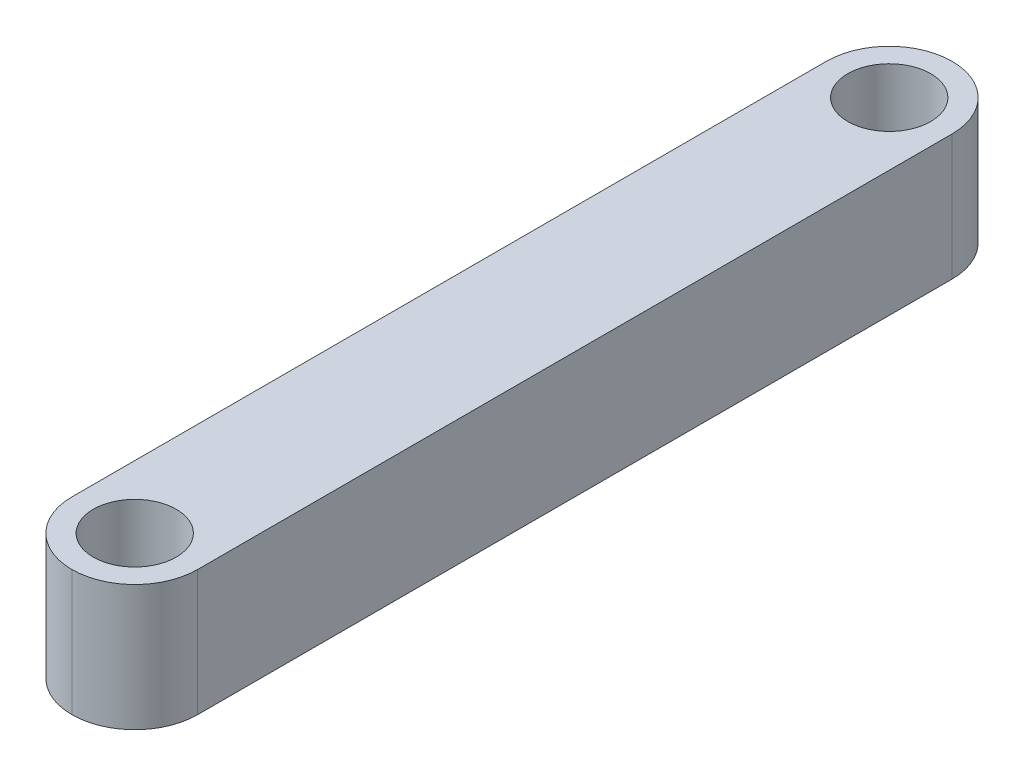
ISO-10303-21;
HEADER;
FILE_DESCRIPTION(('STEP AP214'),'2;1');
FILE_NAME('part.step','',(''),(''),'','','');
FILE_SCHEMA(('AUTOMOTIVE_DESIGN { 1 0 10303 214 1 1 1 1 }'));
ENDSEC;
DATA;
#1=APPLICATION_CONTEXT('core data for automotive mechanical design processes');
#2=APPLICATION_PROTOCOL_DEFINITION('international standard','automotive_design',2000,#1);
#3=PRODUCT_CONTEXT('',#1,'mechanical');
#4=PRODUCT('Part','Part','',(#3));
#5=PRODUCT_RELATED_PRODUCT_CATEGORY('part','',(#4));
#6=PRODUCT_DEFINITION_FORMATION('','',#4);
#7=PRODUCT_DEFINITION_CONTEXT('part definition',#1,'design');
#8=PRODUCT_DEFINITION('design','',#6,#7);
#9=PRODUCT_DEFINITION_SHAPE('','',#8);
#10=(LENGTH_UNIT() NAMED_UNIT(*) SI_UNIT(.MILLI.,.METRE.));
#11=(NAMED_UNIT(*) PLANE_ANGLE_UNIT() SI_UNIT($,.RADIAN.));
#12=(NAMED_UNIT(*) SI_UNIT($,.STERADIAN.) SOLID_ANGLE_UNIT());
#13=UNCERTAINTY_MEASURE_WITH_UNIT(LENGTH_MEASURE(1.E-05),#10,'distance_accuracy_value','');
#14=(GEOMETRIC_REPRESENTATION_CONTEXT(3) GLOBAL_UNCERTAINTY_ASSIGNED_CONTEXT((#13)) GLOBAL_UNIT_ASSIGNED_CONTEXT((#10,
#11,#12)) REPRESENTATION_CONTEXT('',''));
#15=CARTESIAN_POINT('',(0.,0.,0.));
#16=DIRECTION('',(0.,0.,1.));
#17=DIRECTION('',(1.,0.,0.));
#18=AXIS2_PLACEMENT_3D('',#15,#16,#17);
#19=CARTESIAN_POINT('',(0.,50.,0.));
#20=DIRECTION('',(0.,-1.,0.));
#21=DIRECTION('',(0.,0.,-1.));
#22=AXIS2_PLACEMENT_3D('',#19,#20,#21);
#23=PLANE('',#22);
#24=DIRECTION('',(0.,0.,-1.));
#25=VECTOR('',#24,1.);
#26=CARTESIAN_POINT('',(50.,50.,0.));
#27=LINE('',#26,#25);
#28=CARTESIAN_POINT('',(50.,50.,-25.));
#29=VERTEX_POINT('',#28);
#30=CARTESIAN_POINT('',(50.,50.,-325.));
#31=VERTEX_POINT('',#30);
#32=EDGE_CURVE('E111',#29,#31,#27,.T.);
#33=ORIENTED_EDGE('',*,*,#32,.T.);
#34=CARTESIAN_POINT('',(25.,50.,-325.));
#35=DIRECTION('',(0.,-1.,0.));
#36=DIRECTION('',(0.,0.,-1.));
#37=AXIS2_PLACEMENT_3D('',#34,#35,#36);
#38=CIRCLE('',#37,25.);
#39=CARTESIAN_POINT('',(25.,50.,-350.));
#40=VERTEX_POINT('',#39);
#41=EDGE_CURVE('E48',#31,#40,#38,.F.);
#42=ORIENTED_EDGE('',*,*,#41,.T.);
#43=CARTESIAN_POINT('',(25.,50.,-325.));
#44=DIRECTION('',(0.,-1.,0.));
#45=DIRECTION('',(0.,0.,-1.));
#46=AXIS2_PLACEMENT_3D('',#43,#44,#45);
#47=CIRCLE('',#46,25.);
#48=CARTESIAN_POINT('',(0.,50.,-325.));
#49=VERTEX_POINT('',#48);
#50=EDGE_CURVE('E55',#40,#49,#47,.F.);
#51=ORIENTED_EDGE('',*,*,#50,.T.);
#52=DIRECTION('',(0.,0.,1.));
#53=VECTOR('',#52,1.);
#54=CARTESIAN_POINT('',(0.,50.,0.));
#55=LINE('',#54,#53);
#56=CARTESIAN_POINT('',(0.,50.,-25.));
#57=VERTEX_POINT('',#56);
#58=EDGE_CURVE('E119',#49,#57,#55,.T.);
#59=ORIENTED_EDGE('',*,*,#58,.T.);
#60=CARTESIAN_POINT('',(25.,50.,-25.));
#61=DIRECTION('',(0.,-1.,0.));
#62=DIRECTION('',(0.,0.,-1.));
#63=AXIS2_PLACEMENT_3D('',#60,#61,#62);
#64=CIRCLE('',#63,25.);
#65=CARTESIAN_POINT('',(25.,50.,0.));
#66=VERTEX_POINT('',#65);
#67=EDGE_CURVE('E101',#57,#66,#64,.F.);
#68=ORIENTED_EDGE('',*,*,#67,.T.);
#69=CARTESIAN_POINT('',(25.,50.,-25.));
#70=DIRECTION('',(0.,-1.,0.));
#71=DIRECTION('',(0.,0.,-1.));
#72=AXIS2_PLACEMENT_3D('',#69,#70,#71);
#73=CIRCLE('',#72,25.);
#74=EDGE_CURVE('E133',#66,#29,#73,.F.);
#75=ORIENTED_EDGE('',*,*,#74,.T.);
#76=EDGE_LOOP('',(#33,#42,#51,#59,#68,#75));
#77=FACE_BOUND('',#76,.T.);
#78=CARTESIAN_POINT('',(25.,50.,-25.));
#79=DIRECTION('',(0.,1.,0.));
#80=DIRECTION('',(0.,0.,1.));
#81=AXIS2_PLACEMENT_3D('',#78,#79,#80);
#82=CIRCLE('',#81,16.5);
#83=CARTESIAN_POINT('',(25.,50.,-8.5));
#84=VERTEX_POINT('',#83);
#85=EDGE_CURVE('E125',#84,#84,#82,.T.);
#86=ORIENTED_EDGE('',*,*,#85,.F.);
#87=EDGE_LOOP('',(#86));
#88=FACE_BOUND('',#87,.T.);
#89=CARTESIAN_POINT('',(25.,50.,-325.));
#90=DIRECTION('',(0.,1.,0.));
#91=DIRECTION('',(0.,0.,1.));
#92=AXIS2_PLACEMENT_3D('',#89,#90,#91);
#93=CIRCLE('',#92,16.5);
#94=CARTESIAN_POINT('',(25.,50.,-308.5));
#95=VERTEX_POINT('',#94);
#96=EDGE_CURVE('E160',#95,#95,#93,.T.);
#97=ORIENTED_EDGE('',*,*,#96,.F.);
#98=EDGE_LOOP('',(#97));
#99=FACE_BOUND('',#98,.T.);
#100=ADVANCED_FACE('F38',(#77,#88,#99),#23,.F.);
#101=CARTESIAN_POINT('',(0.,0.,0.));
#102=DIRECTION('',(0.,-1.,0.));
#103=DIRECTION('',(0.,0.,-1.));
#104=AXIS2_PLACEMENT_3D('',#101,#102,#103);
#105=PLANE('',#104);
#106=CARTESIAN_POINT('',(25.,0.,-25.));
#107=DIRECTION('',(0.,1.,0.));
#108=DIRECTION('',(0.,0.,1.));
#109=AXIS2_PLACEMENT_3D('',#106,#107,#108);
#110=CIRCLE('',#109,16.5);
#111=CARTESIAN_POINT('',(25.,0.,-8.5));
#112=VERTEX_POINT('',#111);
#113=EDGE_CURVE('E156',#112,#112,#110,.T.);
#114=ORIENTED_EDGE('',*,*,#113,.T.);
#115=EDGE_LOOP('',(#114));
#116=FACE_BOUND('',#115,.T.);
#117=CARTESIAN_POINT('',(25.,0.,-325.));
#118=DIRECTION('',(0.,-1.,0.));
#119=DIRECTION('',(0.,0.,-1.));
#120=AXIS2_PLACEMENT_3D('',#117,#118,#119);
#121=CIRCLE('',#120,25.);
#122=CARTESIAN_POINT('',(0.,0.,-325.));
#123=VERTEX_POINT('',#122);
#124=CARTESIAN_POINT('',(25.,0.,-350.));
#125=VERTEX_POINT('',#124);
#126=EDGE_CURVE('E140',#123,#125,#121,.T.);
#127=ORIENTED_EDGE('',*,*,#126,.T.);
#128=CARTESIAN_POINT('',(25.,0.,-325.));
#129=DIRECTION('',(0.,-1.,0.));
#130=DIRECTION('',(0.,0.,-1.));
#131=AXIS2_PLACEMENT_3D('',#128,#129,#130);
#132=CIRCLE('',#131,25.);
#133=CARTESIAN_POINT('',(50.,0.,-325.));
#134=VERTEX_POINT('',#133);
#135=EDGE_CURVE('E117',#125,#134,#132,.T.);
#136=ORIENTED_EDGE('',*,*,#135,.T.);
#137=DIRECTION('',(0.,0.,-1.));
#138=VECTOR('',#137,1.);
#139=CARTESIAN_POINT('',(50.,0.,0.));
#140=LINE('',#139,#138);
#141=CARTESIAN_POINT('',(50.,0.,-25.));
#142=VERTEX_POINT('',#141);
#143=EDGE_CURVE('E109',#142,#134,#140,.T.);
#144=ORIENTED_EDGE('',*,*,#143,.F.);
#145=CARTESIAN_POINT('',(25.,0.,-25.));
#146=DIRECTION('',(0.,-1.,0.));
#147=DIRECTION('',(0.,0.,-1.));
#148=AXIS2_PLACEMENT_3D('',#145,#146,#147);
#149=CIRCLE('',#148,25.);
#150=CARTESIAN_POINT('',(25.,0.,0.));
#151=VERTEX_POINT('',#150);
#152=EDGE_CURVE('E89',#142,#151,#149,.T.);
#153=ORIENTED_EDGE('',*,*,#152,.T.);
#154=CARTESIAN_POINT('',(25.,0.,-25.));
#155=DIRECTION('',(0.,-1.,0.));
#156=DIRECTION('',(0.,0.,-1.));
#157=AXIS2_PLACEMENT_3D('',#154,#155,#156);
#158=CIRCLE('',#157,25.);
#159=CARTESIAN_POINT('',(0.,0.,-25.));
#160=VERTEX_POINT('',#159);
#161=EDGE_CURVE('E102',#151,#160,#158,.T.);
#162=ORIENTED_EDGE('',*,*,#161,.T.);
#163=DIRECTION('',(0.,0.,1.));
#164=VECTOR('',#163,1.);
#165=CARTESIAN_POINT('',(0.,0.,0.));
#166=LINE('',#165,#164);
#167=EDGE_CURVE('E120',#123,#160,#166,.T.);
#168=ORIENTED_EDGE('',*,*,#167,.F.);
#169=EDGE_LOOP('',(#127,#136,#144,#153,#162,#168));
#170=FACE_BOUND('',#169,.T.);
#171=CARTESIAN_POINT('',(25.,0.,-325.));
#172=DIRECTION('',(0.,1.,0.));
#173=DIRECTION('',(0.,0.,1.));
#174=AXIS2_PLACEMENT_3D('',#171,#172,#173);
#175=CIRCLE('',#174,16.5);
#176=CARTESIAN_POINT('',(25.,0.,-308.5));
#177=VERTEX_POINT('',#176);
#178=EDGE_CURVE('E143',#177,#177,#175,.T.);
#179=ORIENTED_EDGE('',*,*,#178,.T.);
#180=EDGE_LOOP('',(#179));
#181=FACE_BOUND('',#180,.T.);
#182=ADVANCED_FACE('F114',(#116,#170,#181),#105,.T.);
#183=CARTESIAN_POINT('',(0.,50.,0.));
#184=DIRECTION('',(1.,0.,0.));
#185=DIRECTION('',(0.,0.,-1.));
#186=AXIS2_PLACEMENT_3D('',#183,#184,#185);
#187=PLANE('',#186);
#188=ORIENTED_EDGE('',*,*,#58,.F.);
#189=DIRECTION('',(0.,-1.,0.));
#190=VECTOR('',#189,1.);
#191=CARTESIAN_POINT('',(0.,50.,-325.));
#192=LINE('',#191,#190);
#193=EDGE_CURVE('E11',#49,#123,#192,.T.);
#194=ORIENTED_EDGE('',*,*,#193,.T.);
#195=ORIENTED_EDGE('',*,*,#167,.T.);
#196=DIRECTION('',(0.,-1.,0.));
#197=VECTOR('',#196,1.);
#198=CARTESIAN_POINT('',(0.,50.,-25.));
#199=LINE('',#198,#197);
#200=EDGE_CURVE('E136',#160,#57,#199,.F.);
#201=ORIENTED_EDGE('',*,*,#200,.T.);
#202=EDGE_LOOP('',(#188,#194,#195,#201));
#203=FACE_BOUND('',#202,.T.);
#204=ADVANCED_FACE('F180',(#203),#187,.F.);
#205=CARTESIAN_POINT('',(50.,50.,0.));
#206=DIRECTION('',(-1.,0.,0.));
#207=DIRECTION('',(0.,0.,1.));
#208=AXIS2_PLACEMENT_3D('',#205,#206,#207);
#209=PLANE('',#208);
#210=ORIENTED_EDGE('',*,*,#143,.T.);
#211=DIRECTION('',(0.,-1.,0.));
#212=VECTOR('',#211,1.);
#213=CARTESIAN_POINT('',(50.,50.,-325.));
#214=LINE('',#213,#212);
#215=EDGE_CURVE('E148',#134,#31,#214,.F.);
#216=ORIENTED_EDGE('',*,*,#215,.T.);
#217=ORIENTED_EDGE('',*,*,#32,.F.);
#218=DIRECTION('',(0.,-1.,0.));
#219=VECTOR('',#218,1.);
#220=CARTESIAN_POINT('',(50.,50.,-25.));
#221=LINE('',#220,#219);
#222=EDGE_CURVE('E93',#29,#142,#221,.T.);
#223=ORIENTED_EDGE('',*,*,#222,.T.);
#224=EDGE_LOOP('',(#210,#216,#217,#223));
#225=FACE_BOUND('',#224,.T.);
#226=ADVANCED_FACE('F107',(#225),#209,.F.);
#227=CARTESIAN_POINT('',(25.,50.,-25.));
#228=DIRECTION('',(0.,-1.,0.));
#229=DIRECTION('',(0.,0.,-1.));
#230=AXIS2_PLACEMENT_3D('',#227,#228,#229);
#231=CYLINDRICAL_SURFACE('',#230,16.5);
#232=ORIENTED_EDGE('',*,*,#85,.T.);
#233=EDGE_LOOP('',(#232));
#234=FACE_BOUND('',#233,.T.);
#235=ORIENTED_EDGE('',*,*,#113,.F.);
#236=EDGE_LOOP('',(#235));
#237=FACE_BOUND('',#236,.T.);
#238=ADVANCED_FACE('F185',(#234,#237),#231,.F.);
#239=CARTESIAN_POINT('',(25.,50.,-325.));
#240=DIRECTION('',(0.,-1.,0.));
#241=DIRECTION('',(0.,0.,-1.));
#242=AXIS2_PLACEMENT_3D('',#239,#240,#241);
#243=CYLINDRICAL_SURFACE('',#242,16.5);
#244=ORIENTED_EDGE('',*,*,#96,.T.);
#245=EDGE_LOOP('',(#244));
#246=FACE_BOUND('',#245,.T.);
#247=ORIENTED_EDGE('',*,*,#178,.F.);
#248=EDGE_LOOP('',(#247));
#249=FACE_BOUND('',#248,.T.);
#250=ADVANCED_FACE('F171',(#246,#249),#243,.F.);
#251=CARTESIAN_POINT('',(25.,50.,-25.));
#252=DIRECTION('',(0.,-1.,0.));
#253=DIRECTION('',(0.,0.,-1.));
#254=AXIS2_PLACEMENT_3D('',#251,#252,#253);
#255=CYLINDRICAL_SURFACE('',#254,25.);
#256=DIRECTION('',(0.,-1.,0.));
#257=VECTOR('',#256,1.);
#258=CARTESIAN_POINT('',(25.,50.,0.));
#259=LINE('',#258,#257);
#260=EDGE_CURVE('E95',#66,#151,#259,.T.);
#261=ORIENTED_EDGE('',*,*,#260,.F.);
#262=ORIENTED_EDGE('',*,*,#67,.F.);
#263=ORIENTED_EDGE('',*,*,#200,.F.);
#264=ORIENTED_EDGE('',*,*,#161,.F.);
#265=EDGE_LOOP('',(#261,#262,#263,#264));
#266=FACE_BOUND('',#265,.T.);
#267=ADVANCED_FACE('F195',(#266),#255,.T.);
#268=CARTESIAN_POINT('',(25.,50.,-25.));
#269=DIRECTION('',(0.,-1.,0.));
#270=DIRECTION('',(0.,0.,-1.));
#271=AXIS2_PLACEMENT_3D('',#268,#269,#270);
#272=CYLINDRICAL_SURFACE('',#271,25.);
#273=ORIENTED_EDGE('',*,*,#74,.F.);
#274=ORIENTED_EDGE('',*,*,#260,.T.);
#275=ORIENTED_EDGE('',*,*,#152,.F.);
#276=ORIENTED_EDGE('',*,*,#222,.F.);
#277=EDGE_LOOP('',(#273,#274,#275,#276));
#278=FACE_BOUND('',#277,.T.);
#279=ADVANCED_FACE('F92',(#278),#272,.T.);
#280=CARTESIAN_POINT('',(25.,50.,-325.));
#281=DIRECTION('',(0.,-1.,0.));
#282=DIRECTION('',(0.,0.,-1.));
#283=AXIS2_PLACEMENT_3D('',#280,#281,#282);
#284=CYLINDRICAL_SURFACE('',#283,25.);
#285=ORIENTED_EDGE('',*,*,#193,.F.);
#286=ORIENTED_EDGE('',*,*,#50,.F.);
#287=DIRECTION('',(0.,-1.,0.));
#288=VECTOR('',#287,1.);
#289=CARTESIAN_POINT('',(25.,50.,-350.));
#290=LINE('',#289,#288);
#291=EDGE_CURVE('E42',#125,#40,#290,.F.);
#292=ORIENTED_EDGE('',*,*,#291,.F.);
#293=ORIENTED_EDGE('',*,*,#126,.F.);
#294=EDGE_LOOP('',(#285,#286,#292,#293));
#295=FACE_BOUND('',#294,.T.);
#296=ADVANCED_FACE('F40',(#295),#284,.T.);
#297=CARTESIAN_POINT('',(25.,50.,-325.));
#298=DIRECTION('',(0.,-1.,0.));
#299=DIRECTION('',(0.,0.,-1.));
#300=AXIS2_PLACEMENT_3D('',#297,#298,#299);
#301=CYLINDRICAL_SURFACE('',#300,25.);
#302=ORIENTED_EDGE('',*,*,#41,.F.);
#303=ORIENTED_EDGE('',*,*,#215,.F.);
#304=ORIENTED_EDGE('',*,*,#135,.F.);
#305=ORIENTED_EDGE('',*,*,#291,.T.);
#306=EDGE_LOOP('',(#302,#303,#304,#305));
#307=FACE_BOUND('',#306,.T.);
#308=ADVANCED_FACE('F198',(#307),#301,.T.);
#309=CLOSED_SHELL('',(#100,#182,#204,#226,#238,#250,#267,#279,#296,#308));
#310=MANIFOLD_SOLID_BREP('B2',#309);
#311=ADVANCED_BREP_SHAPE_REPRESENTATION('',(#18,#310),#14);
#312=SHAPE_DEFINITION_REPRESENTATION(#9,#311);
ENDSEC;
END-ISO-10303-21;
